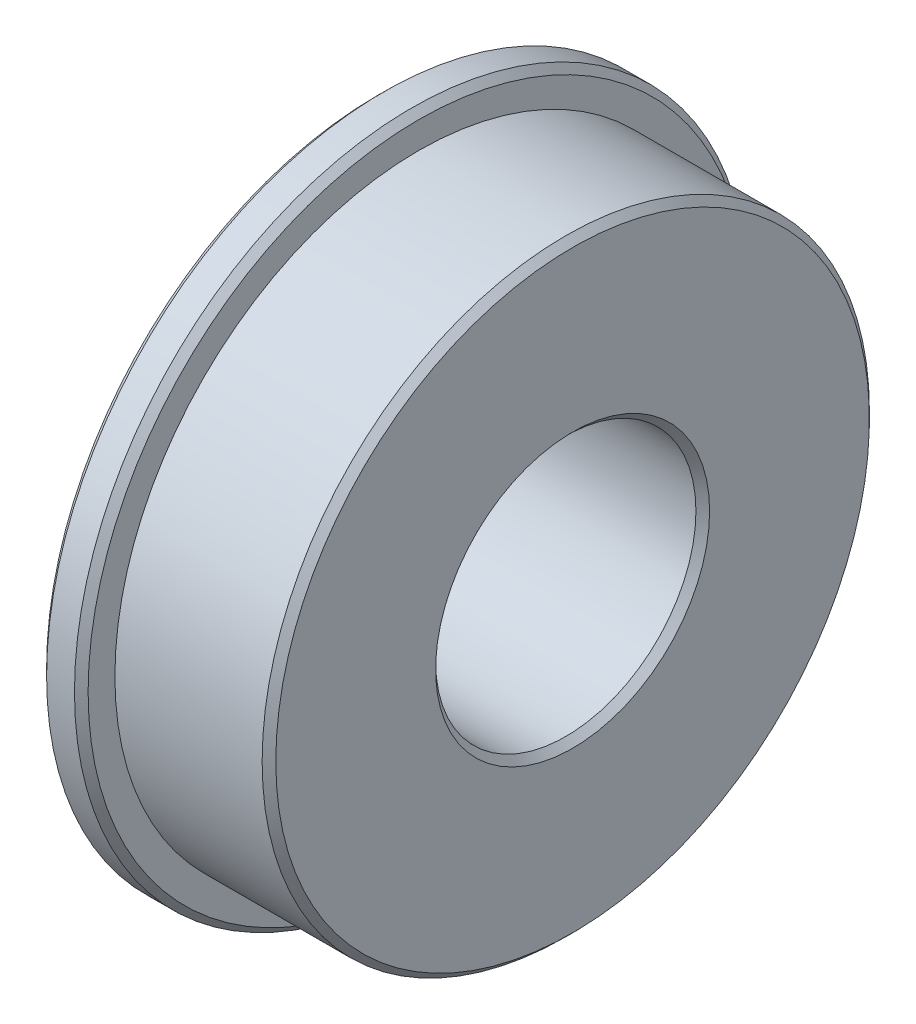
ISO-10303-21;
HEADER;
FILE_DESCRIPTION(('STEP AP214'),'2;1');
FILE_NAME('part.step','',(''),(''),'','','');
FILE_SCHEMA(('AUTOMOTIVE_DESIGN { 1 0 10303 214 1 1 1 1 }'));
ENDSEC;
DATA;
#1=APPLICATION_CONTEXT('core data for automotive mechanical design processes');
#2=APPLICATION_PROTOCOL_DEFINITION('international standard','automotive_design',2000,#1);
#3=PRODUCT_CONTEXT('',#1,'mechanical');
#4=PRODUCT('Part','Part','',(#3));
#5=PRODUCT_RELATED_PRODUCT_CATEGORY('part','',(#4));
#6=PRODUCT_DEFINITION_FORMATION('','',#4);
#7=PRODUCT_DEFINITION_CONTEXT('part definition',#1,'design');
#8=PRODUCT_DEFINITION('design','',#6,#7);
#9=PRODUCT_DEFINITION_SHAPE('','',#8);
#10=(LENGTH_UNIT() NAMED_UNIT(*) SI_UNIT(.MILLI.,.METRE.));
#11=(NAMED_UNIT(*) PLANE_ANGLE_UNIT() SI_UNIT($,.RADIAN.));
#12=(NAMED_UNIT(*) SI_UNIT($,.STERADIAN.) SOLID_ANGLE_UNIT());
#13=UNCERTAINTY_MEASURE_WITH_UNIT(LENGTH_MEASURE(1.E-05),#10,'distance_accuracy_value','');
#14=(GEOMETRIC_REPRESENTATION_CONTEXT(3) GLOBAL_UNCERTAINTY_ASSIGNED_CONTEXT((#13)) GLOBAL_UNIT_ASSIGNED_CONTEXT((#10,
#11,#12)) REPRESENTATION_CONTEXT('',''));
#15=CARTESIAN_POINT('',(0.,0.,0.));
#16=DIRECTION('',(0.,0.,1.));
#17=DIRECTION('',(1.,0.,0.));
#18=AXIS2_PLACEMENT_3D('',#15,#16,#17);
#19=CARTESIAN_POINT('',(6.90999999999999,0.,0.));
#20=DIRECTION('',(-1.,0.,0.));
#21=DIRECTION('',(0.,0.,1.));
#22=AXIS2_PLACEMENT_3D('',#19,#20,#21);
#23=CONICAL_SURFACE('',#22,11.115,0.785398163397434);
#24=CARTESIAN_POINT('',(6.90999999999999,0.,0.));
#25=DIRECTION('',(-1.,0.,0.));
#26=DIRECTION('',(0.,0.,1.));
#27=AXIS2_PLACEMENT_3D('',#24,#25,#26);
#28=CIRCLE('',#27,11.115);
#29=CARTESIAN_POINT('',(6.90999999999999,0.,11.115));
#30=VERTEX_POINT('',#29);
#31=EDGE_CURVE('E30',#30,#30,#28,.T.);
#32=ORIENTED_EDGE('',*,*,#31,.F.);
#33=EDGE_LOOP('',(#32));
#34=FACE_BOUND('',#33,.T.);
#35=CARTESIAN_POINT('',(7.16,0.,0.));
#36=DIRECTION('',(-1.,0.,0.));
#37=DIRECTION('',(0.,0.,1.));
#38=AXIS2_PLACEMENT_3D('',#35,#36,#37);
#39=CIRCLE('',#38,10.865);
#40=CARTESIAN_POINT('',(7.16,0.,10.865));
#41=VERTEX_POINT('',#40);
#42=EDGE_CURVE('E18',#41,#41,#39,.F.);
#43=ORIENTED_EDGE('',*,*,#42,.F.);
#44=EDGE_LOOP('',(#43));
#45=FACE_BOUND('',#44,.T.);
#46=ADVANCED_FACE('F15',(#34,#45),#23,.T.);
#47=CARTESIAN_POINT('',(7.16,0.,0.));
#48=DIRECTION('',(-1.,0.,0.));
#49=DIRECTION('',(0.,0.,1.));
#50=AXIS2_PLACEMENT_3D('',#47,#48,#49);
#51=CYLINDRICAL_SURFACE('',#50,11.115);
#52=CARTESIAN_POINT('',(1.52,0.,0.));
#53=DIRECTION('',(-1.,0.,0.));
#54=DIRECTION('',(0.,0.,1.));
#55=AXIS2_PLACEMENT_3D('',#52,#53,#54);
#56=CIRCLE('',#55,11.115);
#57=CARTESIAN_POINT('',(1.52,0.,11.115));
#58=VERTEX_POINT('',#57);
#59=EDGE_CURVE('E39',#58,#58,#56,.T.);
#60=ORIENTED_EDGE('',*,*,#59,.F.);
#61=EDGE_LOOP('',(#60));
#62=FACE_BOUND('',#61,.T.);
#63=ORIENTED_EDGE('',*,*,#31,.T.);
#64=EDGE_LOOP('',(#63));
#65=FACE_BOUND('',#64,.T.);
#66=ADVANCED_FACE('F49',(#62,#65),#51,.T.);
#67=CARTESIAN_POINT('',(7.16,0.,0.));
#68=DIRECTION('',(1.,0.,0.));
#69=DIRECTION('',(0.,0.,-1.));
#70=AXIS2_PLACEMENT_3D('',#67,#68,#69);
#71=PLANE('',#70);
#72=ORIENTED_EDGE('',*,*,#42,.T.);
#73=EDGE_LOOP('',(#72));
#74=FACE_BOUND('',#73,.T.);
#75=CARTESIAN_POINT('',(7.1599999999421,0.,0.));
#76=DIRECTION('',(1.,0.,0.));
#77=DIRECTION('',(0.,0.,-1.));
#78=AXIS2_PLACEMENT_3D('',#75,#76,#77);
#79=CIRCLE('',#78,5.01499999995758);
#80=CARTESIAN_POINT('',(7.1599999999421,0.,-5.01499999995758));
#81=VERTEX_POINT('',#80);
#82=EDGE_CURVE('E37',#81,#81,#79,.F.);
#83=ORIENTED_EDGE('',*,*,#82,.T.);
#84=EDGE_LOOP('',(#83));
#85=FACE_BOUND('',#84,.T.);
#86=ADVANCED_FACE('F57',(#74,#85),#71,.T.);
#87=CARTESIAN_POINT('',(1.52,0.,0.));
#88=DIRECTION('',(1.,0.,0.));
#89=DIRECTION('',(0.,0.,-1.));
#90=AXIS2_PLACEMENT_3D('',#87,#88,#89);
#91=PLANE('',#90);
#92=ORIENTED_EDGE('',*,*,#59,.T.);
#93=EDGE_LOOP('',(#92));
#94=FACE_BOUND('',#93,.T.);
#95=CARTESIAN_POINT('',(1.52,0.,0.));
#96=DIRECTION('',(-1.,0.,0.));
#97=DIRECTION('',(0.,0.,1.));
#98=AXIS2_PLACEMENT_3D('',#95,#96,#97);
#99=CIRCLE('',#98,12.095);
#100=CARTESIAN_POINT('',(1.52,0.,12.095));
#101=VERTEX_POINT('',#100);
#102=EDGE_CURVE('E33',#101,#101,#99,.T.);
#103=ORIENTED_EDGE('',*,*,#102,.F.);
#104=EDGE_LOOP('',(#103));
#105=FACE_BOUND('',#104,.T.);
#106=ADVANCED_FACE('F89',(#94,#105),#91,.T.);
#107=CARTESIAN_POINT('',(7.1599999999421,0.,0.));
#108=DIRECTION('',(1.,0.,0.));
#109=DIRECTION('',(0.,0.,-1.));
#110=AXIS2_PLACEMENT_3D('',#107,#108,#109);
#111=CONICAL_SURFACE('',#110,5.01499999995758,0.785398163511135);
#112=ORIENTED_EDGE('',*,*,#82,.F.);
#113=EDGE_LOOP('',(#112));
#114=FACE_BOUND('',#113,.T.);
#115=CARTESIAN_POINT('',(6.91,0.,0.));
#116=DIRECTION('',(1.,0.,0.));
#117=DIRECTION('',(0.,0.,-1.));
#118=AXIS2_PLACEMENT_3D('',#115,#116,#117);
#119=CIRCLE('',#118,4.765);
#120=CARTESIAN_POINT('',(6.91,0.,-4.765));
#121=VERTEX_POINT('',#120);
#122=EDGE_CURVE('E36',#121,#121,#119,.F.);
#123=ORIENTED_EDGE('',*,*,#122,.T.);
#124=EDGE_LOOP('',(#123));
#125=FACE_BOUND('',#124,.T.);
#126=ADVANCED_FACE('F85',(#114,#125),#111,.F.);
#127=CARTESIAN_POINT('',(1.26999999999999,0.,0.));
#128=DIRECTION('',(-1.,0.,0.));
#129=DIRECTION('',(0.,0.,1.));
#130=AXIS2_PLACEMENT_3D('',#127,#128,#129);
#131=CONICAL_SURFACE('',#130,12.345,0.785398163397438);
#132=ORIENTED_EDGE('',*,*,#102,.T.);
#133=EDGE_LOOP('',(#132));
#134=FACE_BOUND('',#133,.T.);
#135=CARTESIAN_POINT('',(1.26999999999999,0.,0.));
#136=DIRECTION('',(-1.,0.,0.));
#137=DIRECTION('',(0.,0.,1.));
#138=AXIS2_PLACEMENT_3D('',#135,#136,#137);
#139=CIRCLE('',#138,12.345);
#140=CARTESIAN_POINT('',(1.26999999999999,0.,12.345));
#141=VERTEX_POINT('',#140);
#142=EDGE_CURVE('E101',#141,#141,#139,.T.);
#143=ORIENTED_EDGE('',*,*,#142,.F.);
#144=EDGE_LOOP('',(#143));
#145=FACE_BOUND('',#144,.T.);
#146=ADVANCED_FACE('F81',(#134,#145),#131,.T.);
#147=CARTESIAN_POINT('',(0.,0.,0.));
#148=DIRECTION('',(1.,0.,0.));
#149=DIRECTION('',(0.,0.,-1.));
#150=AXIS2_PLACEMENT_3D('',#147,#148,#149);
#151=CYLINDRICAL_SURFACE('',#150,4.765);
#152=ORIENTED_EDGE('',*,*,#122,.F.);
#153=EDGE_LOOP('',(#152));
#154=FACE_BOUND('',#153,.T.);
#155=CARTESIAN_POINT('',(0.249999999994088,0.,0.));
#156=DIRECTION('',(-1.,0.,0.));
#157=DIRECTION('',(0.,0.,1.));
#158=AXIS2_PLACEMENT_3D('',#155,#156,#157);
#159=CIRCLE('',#158,4.76500000002034);
#160=CARTESIAN_POINT('',(0.249999999994088,0.,4.76500000002034));
#161=VERTEX_POINT('',#160);
#162=EDGE_CURVE('E103',#161,#161,#159,.T.);
#163=ORIENTED_EDGE('',*,*,#162,.T.);
#164=EDGE_LOOP('',(#163));
#165=FACE_BOUND('',#164,.T.);
#166=ADVANCED_FACE('F77',(#154,#165),#151,.F.);
#167=CARTESIAN_POINT('',(1.52,0.,0.));
#168=DIRECTION('',(-1.,0.,0.));
#169=DIRECTION('',(0.,0.,1.));
#170=AXIS2_PLACEMENT_3D('',#167,#168,#169);
#171=CYLINDRICAL_SURFACE('',#170,12.345);
#172=ORIENTED_EDGE('',*,*,#142,.T.);
#173=EDGE_LOOP('',(#172));
#174=FACE_BOUND('',#173,.T.);
#175=CARTESIAN_POINT('',(0.250000000000002,0.,0.));
#176=DIRECTION('',(1.,0.,0.));
#177=DIRECTION('',(0.,0.,-1.));
#178=AXIS2_PLACEMENT_3D('',#175,#176,#177);
#179=CIRCLE('',#178,12.345);
#180=CARTESIAN_POINT('',(0.250000000000001,0.,-12.345));
#181=VERTEX_POINT('',#180);
#182=EDGE_CURVE('E27',#181,#181,#179,.F.);
#183=ORIENTED_EDGE('',*,*,#182,.F.);
#184=EDGE_LOOP('',(#183));
#185=FACE_BOUND('',#184,.T.);
#186=ADVANCED_FACE('F73',(#174,#185),#171,.T.);
#187=CARTESIAN_POINT('',(0.,0.,0.));
#188=DIRECTION('',(-1.,0.,0.));
#189=DIRECTION('',(0.,0.,1.));
#190=AXIS2_PLACEMENT_3D('',#187,#188,#189);
#191=CONICAL_SURFACE('',#190,5.01500000001442,0.785398163397448);
#192=CARTESIAN_POINT('',(0.,0.,0.));
#193=DIRECTION('',(-1.,0.,0.));
#194=DIRECTION('',(0.,0.,1.));
#195=AXIS2_PLACEMENT_3D('',#192,#193,#194);
#196=CIRCLE('',#195,5.01500000001442);
#197=CARTESIAN_POINT('',(0.,0.,5.01500000001442));
#198=VERTEX_POINT('',#197);
#199=EDGE_CURVE('E22',#198,#198,#196,.T.);
#200=ORIENTED_EDGE('',*,*,#199,.T.);
#201=EDGE_LOOP('',(#200));
#202=FACE_BOUND('',#201,.T.);
#203=ORIENTED_EDGE('',*,*,#162,.F.);
#204=EDGE_LOOP('',(#203));
#205=FACE_BOUND('',#204,.T.);
#206=ADVANCED_FACE('F67',(#202,#205),#191,.F.);
#207=CARTESIAN_POINT('',(0.250000000000002,0.,0.));
#208=DIRECTION('',(1.,0.,0.));
#209=DIRECTION('',(0.,0.,-1.));
#210=AXIS2_PLACEMENT_3D('',#207,#208,#209);
#211=CONICAL_SURFACE('',#210,12.345,0.785398163397448);
#212=CARTESIAN_POINT('',(0.,0.,0.));
#213=DIRECTION('',(1.,0.,0.));
#214=DIRECTION('',(0.,0.,-1.));
#215=AXIS2_PLACEMENT_3D('',#212,#213,#214);
#216=CIRCLE('',#215,12.095);
#217=CARTESIAN_POINT('',(0.,0.,-12.095));
#218=VERTEX_POINT('',#217);
#219=EDGE_CURVE('E10',#218,#218,#216,.T.);
#220=ORIENTED_EDGE('',*,*,#219,.T.);
#221=EDGE_LOOP('',(#220));
#222=FACE_BOUND('',#221,.T.);
#223=ORIENTED_EDGE('',*,*,#182,.T.);
#224=EDGE_LOOP('',(#223));
#225=FACE_BOUND('',#224,.T.);
#226=ADVANCED_FACE('F61',(#222,#225),#211,.T.);
#227=CARTESIAN_POINT('',(0.,0.,0.));
#228=DIRECTION('',(1.,0.,0.));
#229=DIRECTION('',(0.,0.,-1.));
#230=AXIS2_PLACEMENT_3D('',#227,#228,#229);
#231=PLANE('',#230);
#232=ORIENTED_EDGE('',*,*,#219,.F.);
#233=EDGE_LOOP('',(#232));
#234=FACE_BOUND('',#233,.T.);
#235=ORIENTED_EDGE('',*,*,#199,.F.);
#236=EDGE_LOOP('',(#235));
#237=FACE_BOUND('',#236,.T.);
#238=ADVANCED_FACE('F59',(#234,#237),#231,.F.);
#239=CLOSED_SHELL('',(#46,#66,#86,#106,#126,#146,#166,#186,#206,#226,#238));
#240=MANIFOLD_SOLID_BREP('B1',#239);
#241=ADVANCED_BREP_SHAPE_REPRESENTATION('',(#18,#240),#14);
#242=SHAPE_DEFINITION_REPRESENTATION(#9,#241);
ENDSEC;
END-ISO-10303-21;
